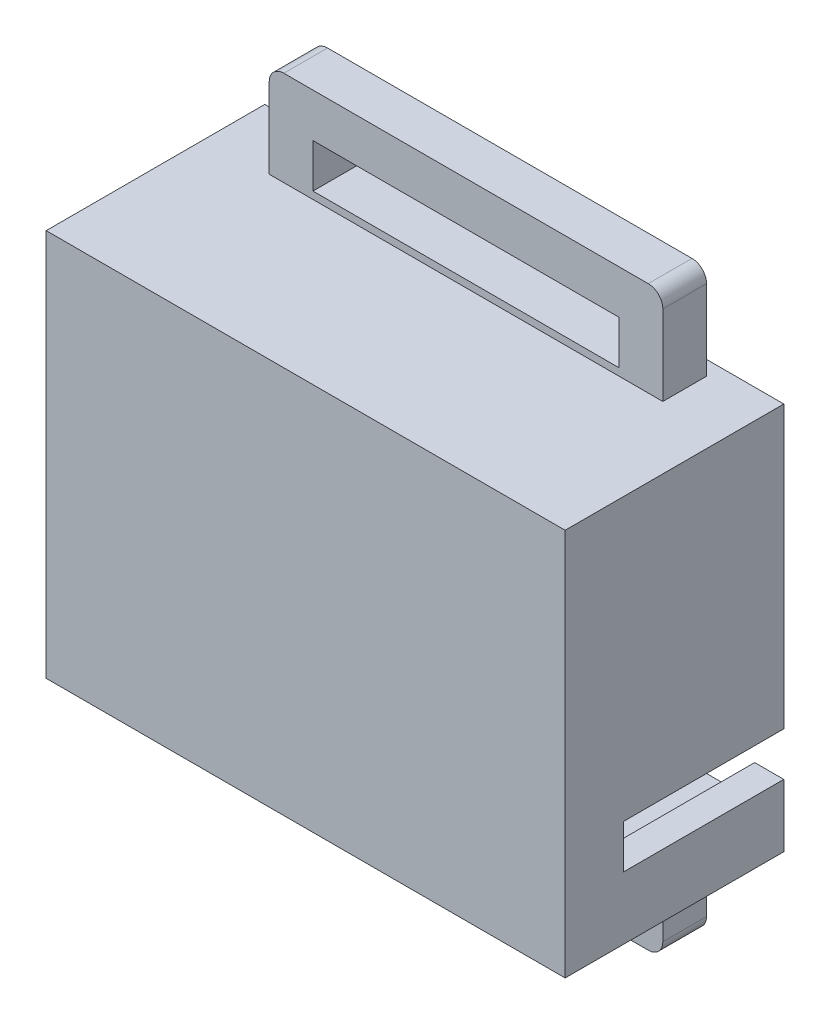
ISO-10303-21;
HEADER;
FILE_DESCRIPTION(('STEP AP214'),'2;1');
FILE_NAME('part.step','',(''),(''),'','','');
FILE_SCHEMA(('AUTOMOTIVE_DESIGN { 1 0 10303 214 1 1 1 1 }'));
ENDSEC;
DATA;
#1=APPLICATION_CONTEXT('core data for automotive mechanical design processes');
#2=APPLICATION_PROTOCOL_DEFINITION('international standard','automotive_design',2000,#1);
#3=PRODUCT_CONTEXT('',#1,'mechanical');
#4=PRODUCT('Part','Part','',(#3));
#5=PRODUCT_RELATED_PRODUCT_CATEGORY('part','',(#4));
#6=PRODUCT_DEFINITION_FORMATION('','',#4);
#7=PRODUCT_DEFINITION_CONTEXT('part definition',#1,'design');
#8=PRODUCT_DEFINITION('design','',#6,#7);
#9=PRODUCT_DEFINITION_SHAPE('','',#8);
#10=(LENGTH_UNIT() NAMED_UNIT(*) SI_UNIT(.MILLI.,.METRE.));
#11=(NAMED_UNIT(*) PLANE_ANGLE_UNIT() SI_UNIT($,.RADIAN.));
#12=(NAMED_UNIT(*) SI_UNIT($,.STERADIAN.) SOLID_ANGLE_UNIT());
#13=UNCERTAINTY_MEASURE_WITH_UNIT(LENGTH_MEASURE(1.E-05),#10,'distance_accuracy_value','');
#14=(GEOMETRIC_REPRESENTATION_CONTEXT(3) GLOBAL_UNCERTAINTY_ASSIGNED_CONTEXT((#13)) GLOBAL_UNIT_ASSIGNED_CONTEXT((#10,
#11,#12)) REPRESENTATION_CONTEXT('',''));
#15=CARTESIAN_POINT('',(0.,0.,0.));
#16=DIRECTION('',(0.,0.,1.));
#17=DIRECTION('',(1.,0.,0.));
#18=AXIS2_PLACEMENT_3D('',#15,#16,#17);
#19=CARTESIAN_POINT('',(-15.8,-11.3,13.));
#20=DIRECTION('',(0.,0.,1.));
#21=DIRECTION('',(1.,0.,0.));
#22=AXIS2_PLACEMENT_3D('',#19,#20,#21);
#23=PLANE('',#22);
#24=DIRECTION('',(1.,0.,0.));
#25=VECTOR('',#24,1.);
#26=CARTESIAN_POINT('',(-15.8,11.3,13.));
#27=LINE('',#26,#25);
#28=CARTESIAN_POINT('',(-15.8,11.3,13.));
#29=VERTEX_POINT('',#28);
#30=CARTESIAN_POINT('',(15.8,11.3,13.));
#31=VERTEX_POINT('',#30);
#32=EDGE_CURVE('E477',#29,#31,#27,.T.);
#33=ORIENTED_EDGE('',*,*,#32,.T.);
#34=DIRECTION('',(0.,1.,0.));
#35=VECTOR('',#34,1.);
#36=CARTESIAN_POINT('',(15.8,-11.3,13.));
#37=LINE('',#36,#35);
#38=CARTESIAN_POINT('',(15.8,-11.3,13.));
#39=VERTEX_POINT('',#38);
#40=EDGE_CURVE('E445',#39,#31,#37,.T.);
#41=ORIENTED_EDGE('',*,*,#40,.F.);
#42=DIRECTION('',(1.,0.,0.));
#43=VECTOR('',#42,1.);
#44=CARTESIAN_POINT('',(-15.8,-11.3,13.));
#45=LINE('',#44,#43);
#46=CARTESIAN_POINT('',(-15.8,-11.3,13.));
#47=VERTEX_POINT('',#46);
#48=EDGE_CURVE('E34',#47,#39,#45,.T.);
#49=ORIENTED_EDGE('',*,*,#48,.F.);
#50=DIRECTION('',(0.,1.,0.));
#51=VECTOR('',#50,1.);
#52=CARTESIAN_POINT('',(-15.8,-11.3,13.));
#53=LINE('',#52,#51);
#54=EDGE_CURVE('E41',#47,#29,#53,.T.);
#55=ORIENTED_EDGE('',*,*,#54,.T.);
#56=EDGE_LOOP('',(#33,#41,#49,#55));
#57=FACE_BOUND('',#56,.T.);
#58=ADVANCED_FACE('F15',(#57),#23,.F.);
#59=CARTESIAN_POINT('',(-10.5,16.8,0.));
#60=DIRECTION('',(0.,1.,0.));
#61=DIRECTION('',(1.,0.,0.));
#62=AXIS2_PLACEMENT_3D('',#59,#60,#61);
#63=PLANE('',#62);
#64=DIRECTION('',(-1.,0.,0.));
#65=VECTOR('',#64,1.);
#66=CARTESIAN_POINT('',(-12.,16.8,4.));
#67=LINE('',#66,#65);
#68=CARTESIAN_POINT('',(10.5,16.8,4.));
#69=VERTEX_POINT('',#68);
#70=CARTESIAN_POINT('',(-10.5,16.8,4.));
#71=VERTEX_POINT('',#70);
#72=EDGE_CURVE('E508',#69,#71,#67,.T.);
#73=ORIENTED_EDGE('',*,*,#72,.T.);
#74=DIRECTION('',(0.,0.,1.));
#75=VECTOR('',#74,1.);
#76=CARTESIAN_POINT('',(-10.5,16.8,0.));
#77=LINE('',#76,#75);
#78=CARTESIAN_POINT('',(-10.5,16.8,1.));
#79=VERTEX_POINT('',#78);
#80=EDGE_CURVE('E9',#79,#71,#77,.T.);
#81=ORIENTED_EDGE('',*,*,#80,.F.);
#82=DIRECTION('',(-1.,0.,0.));
#83=VECTOR('',#82,1.);
#84=CARTESIAN_POINT('',(-12.,16.8,1.));
#85=LINE('',#84,#83);
#86=CARTESIAN_POINT('',(10.5,16.8,1.));
#87=VERTEX_POINT('',#86);
#88=EDGE_CURVE('E474',#87,#79,#85,.T.);
#89=ORIENTED_EDGE('',*,*,#88,.F.);
#90=DIRECTION('',(0.,0.,1.));
#91=VECTOR('',#90,1.);
#92=CARTESIAN_POINT('',(10.5,16.8,0.));
#93=LINE('',#92,#91);
#94=EDGE_CURVE('E23',#87,#69,#93,.T.);
#95=ORIENTED_EDGE('',*,*,#94,.T.);
#96=EDGE_LOOP('',(#73,#81,#89,#95));
#97=FACE_BOUND('',#96,.T.);
#98=ADVANCED_FACE('F675',(#97),#63,.F.);
#99=CARTESIAN_POINT('',(-10.5,13.8,0.));
#100=DIRECTION('',(1.,0.,0.));
#101=DIRECTION('',(0.,1.,0.));
#102=AXIS2_PLACEMENT_3D('',#99,#100,#101);
#103=PLANE('',#102);
#104=DIRECTION('',(0.,0.,1.));
#105=VECTOR('',#104,1.);
#106=CARTESIAN_POINT('',(-10.5,13.8,0.));
#107=LINE('',#106,#105);
#108=CARTESIAN_POINT('',(-10.5,13.8,1.));
#109=VERTEX_POINT('',#108);
#110=CARTESIAN_POINT('',(-10.5,13.8,4.));
#111=VERTEX_POINT('',#110);
#112=EDGE_CURVE('E406',#109,#111,#107,.T.);
#113=ORIENTED_EDGE('',*,*,#112,.F.);
#114=DIRECTION('',(0.,1.,0.));
#115=VECTOR('',#114,1.);
#116=CARTESIAN_POINT('',(-10.5,13.05,1.));
#117=LINE('',#116,#115);
#118=EDGE_CURVE('E473',#109,#79,#117,.T.);
#119=ORIENTED_EDGE('',*,*,#118,.T.);
#120=ORIENTED_EDGE('',*,*,#80,.T.);
#121=DIRECTION('',(0.,1.,0.));
#122=VECTOR('',#121,1.);
#123=CARTESIAN_POINT('',(-10.5,13.05,4.));
#124=LINE('',#123,#122);
#125=EDGE_CURVE('E513',#111,#71,#124,.T.);
#126=ORIENTED_EDGE('',*,*,#125,.F.);
#127=EDGE_LOOP('',(#113,#119,#120,#126));
#128=FACE_BOUND('',#127,.T.);
#129=ADVANCED_FACE('F657',(#128),#103,.T.);
#130=CARTESIAN_POINT('',(10.5,13.8,0.));
#131=DIRECTION('',(1.,0.,0.));
#132=DIRECTION('',(0.,1.,0.));
#133=AXIS2_PLACEMENT_3D('',#130,#131,#132);
#134=PLANE('',#133);
#135=DIRECTION('',(0.,1.,0.));
#136=VECTOR('',#135,1.);
#137=CARTESIAN_POINT('',(10.5,13.05,4.));
#138=LINE('',#137,#136);
#139=CARTESIAN_POINT('',(10.5,13.8,4.));
#140=VERTEX_POINT('',#139);
#141=EDGE_CURVE('E511',#140,#69,#138,.T.);
#142=ORIENTED_EDGE('',*,*,#141,.T.);
#143=ORIENTED_EDGE('',*,*,#94,.F.);
#144=DIRECTION('',(0.,1.,0.));
#145=VECTOR('',#144,1.);
#146=CARTESIAN_POINT('',(10.5,13.05,1.));
#147=LINE('',#146,#145);
#148=CARTESIAN_POINT('',(10.5,13.8,1.));
#149=VERTEX_POINT('',#148);
#150=EDGE_CURVE('E611',#149,#87,#147,.T.);
#151=ORIENTED_EDGE('',*,*,#150,.F.);
#152=DIRECTION('',(0.,0.,1.));
#153=VECTOR('',#152,1.);
#154=CARTESIAN_POINT('',(10.5,13.8,0.));
#155=LINE('',#154,#153);
#156=EDGE_CURVE('E650',#149,#140,#155,.T.);
#157=ORIENTED_EDGE('',*,*,#156,.T.);
#158=EDGE_LOOP('',(#142,#143,#151,#157));
#159=FACE_BOUND('',#158,.T.);
#160=ADVANCED_FACE('F663',(#159),#134,.F.);
#161=CARTESIAN_POINT('',(-10.5,13.8,0.));
#162=DIRECTION('',(0.,1.,0.));
#163=DIRECTION('',(1.,0.,0.));
#164=AXIS2_PLACEMENT_3D('',#161,#162,#163);
#165=PLANE('',#164);
#166=ORIENTED_EDGE('',*,*,#156,.F.);
#167=DIRECTION('',(-1.,0.,0.));
#168=VECTOR('',#167,1.);
#169=CARTESIAN_POINT('',(-12.,13.8,1.));
#170=LINE('',#169,#168);
#171=EDGE_CURVE('E450',#149,#109,#170,.T.);
#172=ORIENTED_EDGE('',*,*,#171,.T.);
#173=ORIENTED_EDGE('',*,*,#112,.T.);
#174=DIRECTION('',(-1.,0.,0.));
#175=VECTOR('',#174,1.);
#176=CARTESIAN_POINT('',(-12.,13.8,4.));
#177=LINE('',#176,#175);
#178=EDGE_CURVE('E432',#140,#111,#177,.T.);
#179=ORIENTED_EDGE('',*,*,#178,.F.);
#180=EDGE_LOOP('',(#166,#172,#173,#179));
#181=FACE_BOUND('',#180,.T.);
#182=ADVANCED_FACE('F652',(#181),#165,.T.);
#183=CARTESIAN_POINT('',(12.5,18.8,1.));
#184=DIRECTION('',(0.,0.,1.));
#185=DIRECTION('',(1.,0.,0.));
#186=AXIS2_PLACEMENT_3D('',#183,#184,#185);
#187=CYLINDRICAL_SURFACE('',#186,1.);
#188=CARTESIAN_POINT('',(12.5,18.8,1.));
#189=DIRECTION('',(0.,0.,1.));
#190=DIRECTION('',(0.,-1.,0.));
#191=AXIS2_PLACEMENT_3D('',#188,#189,#190);
#192=CIRCLE('',#191,1.);
#193=CARTESIAN_POINT('',(13.5,18.8,1.));
#194=VERTEX_POINT('',#193);
#195=CARTESIAN_POINT('',(12.5,19.8,1.));
#196=VERTEX_POINT('',#195);
#197=EDGE_CURVE('E610',#194,#196,#192,.T.);
#198=ORIENTED_EDGE('',*,*,#197,.T.);
#199=DIRECTION('',(0.,0.,1.));
#200=VECTOR('',#199,1.);
#201=CARTESIAN_POINT('',(12.5,19.8,1.));
#202=LINE('',#201,#200);
#203=CARTESIAN_POINT('',(12.5,19.8,4.));
#204=VERTEX_POINT('',#203);
#205=EDGE_CURVE('E583',#196,#204,#202,.T.);
#206=ORIENTED_EDGE('',*,*,#205,.T.);
#207=CARTESIAN_POINT('',(12.5,18.8,4.));
#208=DIRECTION('',(0.,0.,1.));
#209=DIRECTION('',(0.,-1.,0.));
#210=AXIS2_PLACEMENT_3D('',#207,#208,#209);
#211=CIRCLE('',#210,1.);
#212=CARTESIAN_POINT('',(13.5,18.8,4.));
#213=VERTEX_POINT('',#212);
#214=EDGE_CURVE('E580',#213,#204,#211,.T.);
#215=ORIENTED_EDGE('',*,*,#214,.F.);
#216=DIRECTION('',(0.,0.,1.));
#217=VECTOR('',#216,1.);
#218=CARTESIAN_POINT('',(13.5,18.8,1.));
#219=LINE('',#218,#217);
#220=EDGE_CURVE('E362',#194,#213,#219,.T.);
#221=ORIENTED_EDGE('',*,*,#220,.F.);
#222=EDGE_LOOP('',(#198,#206,#215,#221));
#223=FACE_BOUND('',#222,.T.);
#224=ADVANCED_FACE('F784',(#223),#187,.T.);
#225=CARTESIAN_POINT('',(-13.5,19.8,1.));
#226=DIRECTION('',(0.,1.,0.));
#227=DIRECTION('',(1.,0.,0.));
#228=AXIS2_PLACEMENT_3D('',#225,#226,#227);
#229=PLANE('',#228);
#230=DIRECTION('',(1.,0.,0.));
#231=VECTOR('',#230,1.);
#232=CARTESIAN_POINT('',(-13.5,19.8,1.));
#233=LINE('',#232,#231);
#234=CARTESIAN_POINT('',(-12.5,19.8,1.));
#235=VERTEX_POINT('',#234);
#236=EDGE_CURVE('E546',#235,#196,#233,.T.);
#237=ORIENTED_EDGE('',*,*,#236,.F.);
#238=DIRECTION('',(0.,0.,1.));
#239=VECTOR('',#238,1.);
#240=CARTESIAN_POINT('',(-12.5,19.8,1.));
#241=LINE('',#240,#239);
#242=CARTESIAN_POINT('',(-12.5,19.8,4.));
#243=VERTEX_POINT('',#242);
#244=EDGE_CURVE('E578',#235,#243,#241,.T.);
#245=ORIENTED_EDGE('',*,*,#244,.T.);
#246=DIRECTION('',(1.,0.,0.));
#247=VECTOR('',#246,1.);
#248=CARTESIAN_POINT('',(-13.5,19.8,4.));
#249=LINE('',#248,#247);
#250=EDGE_CURVE('E434',#243,#204,#249,.T.);
#251=ORIENTED_EDGE('',*,*,#250,.T.);
#252=ORIENTED_EDGE('',*,*,#205,.F.);
#253=EDGE_LOOP('',(#237,#245,#251,#252));
#254=FACE_BOUND('',#253,.T.);
#255=ADVANCED_FACE('F725',(#254),#229,.T.);
#256=CARTESIAN_POINT('',(-12.5,18.8,1.));
#257=DIRECTION('',(0.,0.,1.));
#258=DIRECTION('',(-1.,0.,0.));
#259=AXIS2_PLACEMENT_3D('',#256,#257,#258);
#260=CYLINDRICAL_SURFACE('',#259,1.);
#261=DIRECTION('',(0.,0.,1.));
#262=VECTOR('',#261,1.);
#263=CARTESIAN_POINT('',(-13.5,18.8,1.));
#264=LINE('',#263,#262);
#265=CARTESIAN_POINT('',(-13.5,18.8,1.));
#266=VERTEX_POINT('',#265);
#267=CARTESIAN_POINT('',(-13.5,18.8,4.));
#268=VERTEX_POINT('',#267);
#269=EDGE_CURVE('E528',#266,#268,#264,.T.);
#270=ORIENTED_EDGE('',*,*,#269,.T.);
#271=CARTESIAN_POINT('',(-12.5,18.8,4.));
#272=DIRECTION('',(0.,0.,-1.));
#273=DIRECTION('',(0.,-1.,0.));
#274=AXIS2_PLACEMENT_3D('',#271,#272,#273);
#275=CIRCLE('',#274,1.);
#276=EDGE_CURVE('E429',#268,#243,#275,.T.);
#277=ORIENTED_EDGE('',*,*,#276,.T.);
#278=ORIENTED_EDGE('',*,*,#244,.F.);
#279=CARTESIAN_POINT('',(-12.5,18.8,1.));
#280=DIRECTION('',(0.,0.,-1.));
#281=DIRECTION('',(0.,-1.,0.));
#282=AXIS2_PLACEMENT_3D('',#279,#280,#281);
#283=CIRCLE('',#282,1.);
#284=EDGE_CURVE('E364',#266,#235,#283,.T.);
#285=ORIENTED_EDGE('',*,*,#284,.F.);
#286=EDGE_LOOP('',(#270,#277,#278,#285));
#287=FACE_BOUND('',#286,.T.);
#288=ADVANCED_FACE('F721',(#287),#260,.T.);
#289=CARTESIAN_POINT('',(-10.5,-13.8,0.));
#290=DIRECTION('',(0.,1.,0.));
#291=DIRECTION('',(1.,0.,0.));
#292=AXIS2_PLACEMENT_3D('',#289,#290,#291);
#293=PLANE('',#292);
#294=DIRECTION('',(-1.,0.,0.));
#295=VECTOR('',#294,1.);
#296=CARTESIAN_POINT('',(-12.,-13.8,4.));
#297=LINE('',#296,#295);
#298=CARTESIAN_POINT('',(10.5,-13.8,4.));
#299=VERTEX_POINT('',#298);
#300=CARTESIAN_POINT('',(-10.5,-13.8,4.));
#301=VERTEX_POINT('',#300);
#302=EDGE_CURVE('E334',#299,#301,#297,.T.);
#303=ORIENTED_EDGE('',*,*,#302,.T.);
#304=DIRECTION('',(0.,0.,1.));
#305=VECTOR('',#304,1.);
#306=CARTESIAN_POINT('',(-10.5,-13.8,0.));
#307=LINE('',#306,#305);
#308=CARTESIAN_POINT('',(-10.5,-13.8,1.));
#309=VERTEX_POINT('',#308);
#310=EDGE_CURVE('E582',#309,#301,#307,.T.);
#311=ORIENTED_EDGE('',*,*,#310,.F.);
#312=DIRECTION('',(-1.,0.,0.));
#313=VECTOR('',#312,1.);
#314=CARTESIAN_POINT('',(-12.,-13.8,1.));
#315=LINE('',#314,#313);
#316=CARTESIAN_POINT('',(10.5,-13.8,1.));
#317=VERTEX_POINT('',#316);
#318=EDGE_CURVE('E382',#317,#309,#315,.T.);
#319=ORIENTED_EDGE('',*,*,#318,.F.);
#320=DIRECTION('',(0.,0.,1.));
#321=VECTOR('',#320,1.);
#322=CARTESIAN_POINT('',(10.5,-13.8,0.));
#323=LINE('',#322,#321);
#324=EDGE_CURVE('E639',#317,#299,#323,.T.);
#325=ORIENTED_EDGE('',*,*,#324,.T.);
#326=EDGE_LOOP('',(#303,#311,#319,#325));
#327=FACE_BOUND('',#326,.T.);
#328=ADVANCED_FACE('F723',(#327),#293,.F.);
#329=CARTESIAN_POINT('',(-10.5,-16.8,0.));
#330=DIRECTION('',(1.,0.,0.));
#331=DIRECTION('',(0.,1.,0.));
#332=AXIS2_PLACEMENT_3D('',#329,#330,#331);
#333=PLANE('',#332);
#334=DIRECTION('',(0.,0.,1.));
#335=VECTOR('',#334,1.);
#336=CARTESIAN_POINT('',(-10.5,-16.8,0.));
#337=LINE('',#336,#335);
#338=CARTESIAN_POINT('',(-10.5,-16.8,1.));
#339=VERTEX_POINT('',#338);
#340=CARTESIAN_POINT('',(-10.5,-16.8,4.));
#341=VERTEX_POINT('',#340);
#342=EDGE_CURVE('E345',#339,#341,#337,.T.);
#343=ORIENTED_EDGE('',*,*,#342,.F.);
#344=DIRECTION('',(0.,1.,0.));
#345=VECTOR('',#344,1.);
#346=CARTESIAN_POINT('',(-10.5,-18.3,1.));
#347=LINE('',#346,#345);
#348=EDGE_CURVE('E527',#339,#309,#347,.T.);
#349=ORIENTED_EDGE('',*,*,#348,.T.);
#350=ORIENTED_EDGE('',*,*,#310,.T.);
#351=DIRECTION('',(0.,1.,0.));
#352=VECTOR('',#351,1.);
#353=CARTESIAN_POINT('',(-10.5,-18.3,4.));
#354=LINE('',#353,#352);
#355=EDGE_CURVE('E337',#341,#301,#354,.T.);
#356=ORIENTED_EDGE('',*,*,#355,.F.);
#357=EDGE_LOOP('',(#343,#349,#350,#356));
#358=FACE_BOUND('',#357,.T.);
#359=ADVANCED_FACE('F773',(#358),#333,.T.);
#360=CARTESIAN_POINT('',(10.5,-16.8,0.));
#361=DIRECTION('',(1.,0.,0.));
#362=DIRECTION('',(0.,1.,0.));
#363=AXIS2_PLACEMENT_3D('',#360,#361,#362);
#364=PLANE('',#363);
#365=DIRECTION('',(0.,1.,0.));
#366=VECTOR('',#365,1.);
#367=CARTESIAN_POINT('',(10.5,-18.3,4.));
#368=LINE('',#367,#366);
#369=CARTESIAN_POINT('',(10.5,-16.8,4.));
#370=VERTEX_POINT('',#369);
#371=EDGE_CURVE('E336',#370,#299,#368,.T.);
#372=ORIENTED_EDGE('',*,*,#371,.T.);
#373=ORIENTED_EDGE('',*,*,#324,.F.);
#374=DIRECTION('',(0.,1.,0.));
#375=VECTOR('',#374,1.);
#376=CARTESIAN_POINT('',(10.5,-18.3,1.));
#377=LINE('',#376,#375);
#378=CARTESIAN_POINT('',(10.5,-16.8,1.));
#379=VERTEX_POINT('',#378);
#380=EDGE_CURVE('E377',#379,#317,#377,.T.);
#381=ORIENTED_EDGE('',*,*,#380,.F.);
#382=DIRECTION('',(0.,0.,1.));
#383=VECTOR('',#382,1.);
#384=CARTESIAN_POINT('',(10.5,-16.8,0.));
#385=LINE('',#384,#383);
#386=EDGE_CURVE('E338',#379,#370,#385,.T.);
#387=ORIENTED_EDGE('',*,*,#386,.T.);
#388=EDGE_LOOP('',(#372,#373,#381,#387));
#389=FACE_BOUND('',#388,.T.);
#390=ADVANCED_FACE('F772',(#389),#364,.F.);
#391=CARTESIAN_POINT('',(-10.5,-16.8,0.));
#392=DIRECTION('',(0.,1.,0.));
#393=DIRECTION('',(1.,0.,0.));
#394=AXIS2_PLACEMENT_3D('',#391,#392,#393);
#395=PLANE('',#394);
#396=ORIENTED_EDGE('',*,*,#386,.F.);
#397=DIRECTION('',(-1.,0.,0.));
#398=VECTOR('',#397,1.);
#399=CARTESIAN_POINT('',(-12.,-16.8,1.));
#400=LINE('',#399,#398);
#401=EDGE_CURVE('E525',#379,#339,#400,.T.);
#402=ORIENTED_EDGE('',*,*,#401,.T.);
#403=ORIENTED_EDGE('',*,*,#342,.T.);
#404=DIRECTION('',(-1.,0.,0.));
#405=VECTOR('',#404,1.);
#406=CARTESIAN_POINT('',(-12.,-16.8,4.));
#407=LINE('',#406,#405);
#408=EDGE_CURVE('E534',#370,#341,#407,.T.);
#409=ORIENTED_EDGE('',*,*,#408,.F.);
#410=EDGE_LOOP('',(#396,#402,#403,#409));
#411=FACE_BOUND('',#410,.T.);
#412=ADVANCED_FACE('F770',(#411),#395,.T.);
#413=CARTESIAN_POINT('',(-13.5,-19.8,1.));
#414=DIRECTION('',(0.,1.,0.));
#415=DIRECTION('',(1.,0.,0.));
#416=AXIS2_PLACEMENT_3D('',#413,#414,#415);
#417=PLANE('',#416);
#418=DIRECTION('',(0.,0.,1.));
#419=VECTOR('',#418,1.);
#420=CARTESIAN_POINT('',(12.5,-19.8,1.));
#421=LINE('',#420,#419);
#422=CARTESIAN_POINT('',(12.5,-19.8,1.));
#423=VERTEX_POINT('',#422);
#424=CARTESIAN_POINT('',(12.5,-19.8,4.));
#425=VERTEX_POINT('',#424);
#426=EDGE_CURVE('E343',#423,#425,#421,.T.);
#427=ORIENTED_EDGE('',*,*,#426,.T.);
#428=DIRECTION('',(1.,0.,0.));
#429=VECTOR('',#428,1.);
#430=CARTESIAN_POINT('',(-13.5,-19.8,4.));
#431=LINE('',#430,#429);
#432=CARTESIAN_POINT('',(-12.5,-19.8,4.));
#433=VERTEX_POINT('',#432);
#434=EDGE_CURVE('E520',#433,#425,#431,.T.);
#435=ORIENTED_EDGE('',*,*,#434,.F.);
#436=DIRECTION('',(0.,0.,1.));
#437=VECTOR('',#436,1.);
#438=CARTESIAN_POINT('',(-12.5,-19.8,1.));
#439=LINE('',#438,#437);
#440=CARTESIAN_POINT('',(-12.5,-19.8,1.));
#441=VERTEX_POINT('',#440);
#442=EDGE_CURVE('E335',#441,#433,#439,.T.);
#443=ORIENTED_EDGE('',*,*,#442,.F.);
#444=DIRECTION('',(1.,0.,0.));
#445=VECTOR('',#444,1.);
#446=CARTESIAN_POINT('',(-13.5,-19.8,1.));
#447=LINE('',#446,#445);
#448=EDGE_CURVE('E423',#441,#423,#447,.T.);
#449=ORIENTED_EDGE('',*,*,#448,.T.);
#450=EDGE_LOOP('',(#427,#435,#443,#449));
#451=FACE_BOUND('',#450,.T.);
#452=ADVANCED_FACE('F763',(#451),#417,.F.);
#453=CARTESIAN_POINT('',(12.5,-18.8,1.));
#454=DIRECTION('',(0.,0.,1.));
#455=DIRECTION('',(1.,0.,0.));
#456=AXIS2_PLACEMENT_3D('',#453,#454,#455);
#457=CYLINDRICAL_SURFACE('',#456,1.);
#458=DIRECTION('',(0.,0.,1.));
#459=VECTOR('',#458,1.);
#460=CARTESIAN_POINT('',(13.5,-18.8,1.));
#461=LINE('',#460,#459);
#462=CARTESIAN_POINT('',(13.5,-18.8,1.));
#463=VERTEX_POINT('',#462);
#464=CARTESIAN_POINT('',(13.5,-18.8,4.));
#465=VERTEX_POINT('',#464);
#466=EDGE_CURVE('E392',#463,#465,#461,.T.);
#467=ORIENTED_EDGE('',*,*,#466,.T.);
#468=CARTESIAN_POINT('',(12.5,-18.8,4.));
#469=DIRECTION('',(0.,0.,-1.));
#470=DIRECTION('',(0.,-1.,0.));
#471=AXIS2_PLACEMENT_3D('',#468,#469,#470);
#472=CIRCLE('',#471,1.);
#473=EDGE_CURVE('E521',#465,#425,#472,.T.);
#474=ORIENTED_EDGE('',*,*,#473,.T.);
#475=ORIENTED_EDGE('',*,*,#426,.F.);
#476=CARTESIAN_POINT('',(12.5,-18.8,1.));
#477=DIRECTION('',(0.,0.,-1.));
#478=DIRECTION('',(0.,-1.,0.));
#479=AXIS2_PLACEMENT_3D('',#476,#477,#478);
#480=CIRCLE('',#479,1.);
#481=EDGE_CURVE('E391',#463,#423,#480,.T.);
#482=ORIENTED_EDGE('',*,*,#481,.F.);
#483=EDGE_LOOP('',(#467,#474,#475,#482));
#484=FACE_BOUND('',#483,.T.);
#485=ADVANCED_FACE('F757',(#484),#457,.T.);
#486=CARTESIAN_POINT('',(-12.5,-18.8,1.));
#487=DIRECTION('',(0.,0.,1.));
#488=DIRECTION('',(-1.,0.,0.));
#489=AXIS2_PLACEMENT_3D('',#486,#487,#488);
#490=CYLINDRICAL_SURFACE('',#489,1.);
#491=CARTESIAN_POINT('',(-12.5,-18.8,1.));
#492=DIRECTION('',(0.,0.,1.));
#493=DIRECTION('',(0.,-1.,0.));
#494=AXIS2_PLACEMENT_3D('',#491,#492,#493);
#495=CIRCLE('',#494,1.);
#496=CARTESIAN_POINT('',(-13.5,-18.8,1.));
#497=VERTEX_POINT('',#496);
#498=EDGE_CURVE('E383',#497,#441,#495,.T.);
#499=ORIENTED_EDGE('',*,*,#498,.T.);
#500=ORIENTED_EDGE('',*,*,#442,.T.);
#501=CARTESIAN_POINT('',(-12.5,-18.8,4.));
#502=DIRECTION('',(0.,0.,1.));
#503=DIRECTION('',(0.,-1.,0.));
#504=AXIS2_PLACEMENT_3D('',#501,#502,#503);
#505=CIRCLE('',#504,1.);
#506=CARTESIAN_POINT('',(-13.5,-18.8,4.));
#507=VERTEX_POINT('',#506);
#508=EDGE_CURVE('E510',#507,#433,#505,.T.);
#509=ORIENTED_EDGE('',*,*,#508,.F.);
#510=DIRECTION('',(0.,0.,1.));
#511=VECTOR('',#510,1.);
#512=CARTESIAN_POINT('',(-13.5,-18.8,1.));
#513=LINE('',#512,#511);
#514=EDGE_CURVE('E367',#497,#507,#513,.T.);
#515=ORIENTED_EDGE('',*,*,#514,.F.);
#516=EDGE_LOOP('',(#499,#500,#509,#515));
#517=FACE_BOUND('',#516,.T.);
#518=ADVANCED_FACE('F752',(#517),#490,.T.);
#519=CARTESIAN_POINT('',(14.8,-9.,11.));
#520=DIRECTION('',(0.,0.,1.));
#521=DIRECTION('',(1.,0.,0.));
#522=AXIS2_PLACEMENT_3D('',#519,#520,#521);
#523=PLANE('',#522);
#524=DIRECTION('',(0.,-1.,0.));
#525=VECTOR('',#524,1.);
#526=CARTESIAN_POINT('',(17.8,-11.15,11.));
#527=LINE('',#526,#525);
#528=CARTESIAN_POINT('',(17.8,-6.,11.));
#529=VERTEX_POINT('',#528);
#530=CARTESIAN_POINT('',(17.8,-9.,11.));
#531=VERTEX_POINT('',#530);
#532=EDGE_CURVE('E355',#529,#531,#527,.T.);
#533=ORIENTED_EDGE('',*,*,#532,.T.);
#534=DIRECTION('',(1.,0.,0.));
#535=VECTOR('',#534,1.);
#536=CARTESIAN_POINT('',(14.8,-9.,11.));
#537=LINE('',#536,#535);
#538=CARTESIAN_POINT('',(15.8,-9.,11.));
#539=VERTEX_POINT('',#538);
#540=EDGE_CURVE('E329',#539,#531,#537,.T.);
#541=ORIENTED_EDGE('',*,*,#540,.F.);
#542=DIRECTION('',(0.,-1.,0.));
#543=VECTOR('',#542,1.);
#544=CARTESIAN_POINT('',(15.8,-10.15,11.));
#545=LINE('',#544,#543);
#546=CARTESIAN_POINT('',(15.8,-6.,11.));
#547=VERTEX_POINT('',#546);
#548=EDGE_CURVE('E350',#547,#539,#545,.T.);
#549=ORIENTED_EDGE('',*,*,#548,.F.);
#550=DIRECTION('',(1.,0.,0.));
#551=VECTOR('',#550,1.);
#552=CARTESIAN_POINT('',(14.8,-6.,11.));
#553=LINE('',#552,#551);
#554=EDGE_CURVE('E438',#547,#529,#553,.T.);
#555=ORIENTED_EDGE('',*,*,#554,.T.);
#556=EDGE_LOOP('',(#533,#541,#549,#555));
#557=FACE_BOUND('',#556,.T.);
#558=ADVANCED_FACE('F753',(#557),#523,.F.);
#559=CARTESIAN_POINT('',(14.8,-9.,-1.));
#560=DIRECTION('',(0.,1.,0.));
#561=DIRECTION('',(1.,0.,0.));
#562=AXIS2_PLACEMENT_3D('',#559,#560,#561);
#563=PLANE('',#562);
#564=ORIENTED_EDGE('',*,*,#540,.T.);
#565=DIRECTION('',(0.,0.,1.));
#566=VECTOR('',#565,1.);
#567=CARTESIAN_POINT('',(17.8,-9.,-0.5));
#568=LINE('',#567,#566);
#569=CARTESIAN_POINT('',(17.8,-9.,0.));
#570=VERTEX_POINT('',#569);
#571=EDGE_CURVE('E360',#570,#531,#568,.T.);
#572=ORIENTED_EDGE('',*,*,#571,.F.);
#573=DIRECTION('',(-1.,0.,0.));
#574=VECTOR('',#573,1.);
#575=CARTESIAN_POINT('',(-1.5,-9.,0.));
#576=LINE('',#575,#574);
#577=CARTESIAN_POINT('',(15.8,-9.,0.));
#578=VERTEX_POINT('',#577);
#579=EDGE_CURVE('E479',#570,#578,#576,.T.);
#580=ORIENTED_EDGE('',*,*,#579,.T.);
#581=DIRECTION('',(0.,0.,1.));
#582=VECTOR('',#581,1.);
#583=CARTESIAN_POINT('',(15.8,-9.,-1.));
#584=LINE('',#583,#582);
#585=EDGE_CURVE('E349',#578,#539,#584,.T.);
#586=ORIENTED_EDGE('',*,*,#585,.T.);
#587=EDGE_LOOP('',(#564,#572,#580,#586));
#588=FACE_BOUND('',#587,.T.);
#589=ADVANCED_FACE('F744',(#588),#563,.T.);
#590=CARTESIAN_POINT('',(-15.8,-11.3,-1.));
#591=DIRECTION('',(0.,1.,0.));
#592=DIRECTION('',(1.,0.,0.));
#593=AXIS2_PLACEMENT_3D('',#590,#591,#592);
#594=PLANE('',#593);
#595=DIRECTION('',(0.,0.,1.));
#596=VECTOR('',#595,1.);
#597=CARTESIAN_POINT('',(15.8,-11.3,-1.));
#598=LINE('',#597,#596);
#599=CARTESIAN_POINT('',(15.8,-11.3,0.));
#600=VERTEX_POINT('',#599);
#601=EDGE_CURVE('E482',#600,#39,#598,.T.);
#602=ORIENTED_EDGE('',*,*,#601,.F.);
#603=DIRECTION('',(-1.,0.,0.));
#604=VECTOR('',#603,1.);
#605=CARTESIAN_POINT('',(-16.8,-11.3,0.));
#606=LINE('',#605,#604);
#607=CARTESIAN_POINT('',(-15.8,-11.3,0.));
#608=VERTEX_POINT('',#607);
#609=EDGE_CURVE('E466',#600,#608,#606,.T.);
#610=ORIENTED_EDGE('',*,*,#609,.T.);
#611=DIRECTION('',(0.,0.,1.));
#612=VECTOR('',#611,1.);
#613=CARTESIAN_POINT('',(-15.8,-11.3,-1.));
#614=LINE('',#613,#612);
#615=EDGE_CURVE('E626',#608,#47,#614,.T.);
#616=ORIENTED_EDGE('',*,*,#615,.T.);
#617=ORIENTED_EDGE('',*,*,#48,.T.);
#618=EDGE_LOOP('',(#602,#610,#616,#617));
#619=FACE_BOUND('',#618,.T.);
#620=ADVANCED_FACE('F741',(#619),#594,.T.);
#621=CARTESIAN_POINT('',(-15.8,-11.3,-1.));
#622=DIRECTION('',(1.,0.,0.));
#623=DIRECTION('',(0.,1.,0.));
#624=AXIS2_PLACEMENT_3D('',#621,#622,#623);
#625=PLANE('',#624);
#626=ORIENTED_EDGE('',*,*,#615,.F.);
#627=DIRECTION('',(0.,1.,0.));
#628=VECTOR('',#627,1.);
#629=CARTESIAN_POINT('',(-15.8,-12.3,0.));
#630=LINE('',#629,#628);
#631=CARTESIAN_POINT('',(-15.8,11.3,0.));
#632=VERTEX_POINT('',#631);
#633=EDGE_CURVE('E465',#608,#632,#630,.T.);
#634=ORIENTED_EDGE('',*,*,#633,.T.);
#635=DIRECTION('',(0.,0.,1.));
#636=VECTOR('',#635,1.);
#637=CARTESIAN_POINT('',(-15.8,11.3,-1.));
#638=LINE('',#637,#636);
#639=EDGE_CURVE('E483',#632,#29,#638,.T.);
#640=ORIENTED_EDGE('',*,*,#639,.T.);
#641=ORIENTED_EDGE('',*,*,#54,.F.);
#642=EDGE_LOOP('',(#626,#634,#640,#641));
#643=FACE_BOUND('',#642,.T.);
#644=ADVANCED_FACE('F740',(#643),#625,.T.);
#645=CARTESIAN_POINT('',(-15.8,11.3,-1.));
#646=DIRECTION('',(0.,1.,0.));
#647=DIRECTION('',(1.,0.,0.));
#648=AXIS2_PLACEMENT_3D('',#645,#646,#647);
#649=PLANE('',#648);
#650=ORIENTED_EDGE('',*,*,#32,.F.);
#651=ORIENTED_EDGE('',*,*,#639,.F.);
#652=DIRECTION('',(-1.,0.,0.));
#653=VECTOR('',#652,1.);
#654=CARTESIAN_POINT('',(-16.8,11.3,0.));
#655=LINE('',#654,#653);
#656=CARTESIAN_POINT('',(15.8,11.3,0.));
#657=VERTEX_POINT('',#656);
#658=EDGE_CURVE('E458',#657,#632,#655,.T.);
#659=ORIENTED_EDGE('',*,*,#658,.F.);
#660=DIRECTION('',(0.,0.,1.));
#661=VECTOR('',#660,1.);
#662=CARTESIAN_POINT('',(15.8,11.3,-1.));
#663=LINE('',#662,#661);
#664=EDGE_CURVE('E351',#657,#31,#663,.T.);
#665=ORIENTED_EDGE('',*,*,#664,.T.);
#666=EDGE_LOOP('',(#650,#651,#659,#665));
#667=FACE_BOUND('',#666,.T.);
#668=ADVANCED_FACE('F733',(#667),#649,.F.);
#669=CARTESIAN_POINT('',(15.8,-11.3,-1.));
#670=DIRECTION('',(1.,0.,0.));
#671=DIRECTION('',(0.,1.,0.));
#672=AXIS2_PLACEMENT_3D('',#669,#670,#671);
#673=PLANE('',#672);
#674=ORIENTED_EDGE('',*,*,#40,.T.);
#675=ORIENTED_EDGE('',*,*,#664,.F.);
#676=DIRECTION('',(0.,1.,0.));
#677=VECTOR('',#676,1.);
#678=CARTESIAN_POINT('',(15.8,-12.3,0.));
#679=LINE('',#678,#677);
#680=CARTESIAN_POINT('',(15.8,-6.,0.));
#681=VERTEX_POINT('',#680);
#682=EDGE_CURVE('E452',#681,#657,#679,.T.);
#683=ORIENTED_EDGE('',*,*,#682,.F.);
#684=DIRECTION('',(0.,0.,1.));
#685=VECTOR('',#684,1.);
#686=CARTESIAN_POINT('',(15.8,-6.,-1.));
#687=LINE('',#686,#685);
#688=EDGE_CURVE('E444',#681,#547,#687,.T.);
#689=ORIENTED_EDGE('',*,*,#688,.T.);
#690=ORIENTED_EDGE('',*,*,#548,.T.);
#691=ORIENTED_EDGE('',*,*,#585,.F.);
#692=DIRECTION('',(0.,1.,0.));
#693=VECTOR('',#692,1.);
#694=CARTESIAN_POINT('',(15.8,-12.3,0.));
#695=LINE('',#694,#693);
#696=EDGE_CURVE('E469',#600,#578,#695,.T.);
#697=ORIENTED_EDGE('',*,*,#696,.F.);
#698=ORIENTED_EDGE('',*,*,#601,.T.);
#699=EDGE_LOOP('',(#674,#675,#683,#689,#690,#691,#697,#698));
#700=FACE_BOUND('',#699,.T.);
#701=ADVANCED_FACE('F729',(#700),#673,.F.);
#702=CARTESIAN_POINT('',(14.8,-6.,-1.));
#703=DIRECTION('',(0.,1.,0.));
#704=DIRECTION('',(1.,0.,0.));
#705=AXIS2_PLACEMENT_3D('',#702,#703,#704);
#706=PLANE('',#705);
#707=ORIENTED_EDGE('',*,*,#688,.F.);
#708=DIRECTION('',(-1.,0.,0.));
#709=VECTOR('',#708,1.);
#710=CARTESIAN_POINT('',(-1.5,-6.,0.));
#711=LINE('',#710,#709);
#712=CARTESIAN_POINT('',(17.8,-6.,0.));
#713=VERTEX_POINT('',#712);
#714=EDGE_CURVE('E397',#713,#681,#711,.T.);
#715=ORIENTED_EDGE('',*,*,#714,.F.);
#716=DIRECTION('',(0.,0.,1.));
#717=VECTOR('',#716,1.);
#718=CARTESIAN_POINT('',(17.8,-6.,-0.5));
#719=LINE('',#718,#717);
#720=EDGE_CURVE('E356',#713,#529,#719,.T.);
#721=ORIENTED_EDGE('',*,*,#720,.T.);
#722=ORIENTED_EDGE('',*,*,#554,.F.);
#723=EDGE_LOOP('',(#707,#715,#721,#722));
#724=FACE_BOUND('',#723,.T.);
#725=ADVANCED_FACE('F685',(#724),#706,.F.);
#726=CARTESIAN_POINT('',(-13.5,12.3,1.));
#727=DIRECTION('',(0.,0.,1.));
#728=DIRECTION('',(1.,0.,0.));
#729=AXIS2_PLACEMENT_3D('',#726,#727,#728);
#730=PLANE('',#729);
#731=ORIENTED_EDGE('',*,*,#150,.T.);
#732=ORIENTED_EDGE('',*,*,#88,.T.);
#733=ORIENTED_EDGE('',*,*,#118,.F.);
#734=ORIENTED_EDGE('',*,*,#171,.F.);
#735=EDGE_LOOP('',(#731,#732,#733,#734));
#736=FACE_BOUND('',#735,.T.);
#737=ORIENTED_EDGE('',*,*,#284,.T.);
#738=ORIENTED_EDGE('',*,*,#236,.T.);
#739=ORIENTED_EDGE('',*,*,#197,.F.);
#740=DIRECTION('',(0.,1.,0.));
#741=VECTOR('',#740,1.);
#742=CARTESIAN_POINT('',(13.5,12.3,1.));
#743=LINE('',#742,#741);
#744=CARTESIAN_POINT('',(13.5,13.3,1.));
#745=VERTEX_POINT('',#744);
#746=EDGE_CURVE('E368',#745,#194,#743,.T.);
#747=ORIENTED_EDGE('',*,*,#746,.F.);
#748=DIRECTION('',(1.,0.,0.));
#749=VECTOR('',#748,1.);
#750=CARTESIAN_POINT('',(-15.65,13.3,1.));
#751=LINE('',#750,#749);
#752=CARTESIAN_POINT('',(-13.5,13.3,1.));
#753=VERTEX_POINT('',#752);
#754=EDGE_CURVE('E380',#753,#745,#751,.T.);
#755=ORIENTED_EDGE('',*,*,#754,.F.);
#756=DIRECTION('',(0.,1.,0.));
#757=VECTOR('',#756,1.);
#758=CARTESIAN_POINT('',(-13.5,12.3,1.));
#759=LINE('',#758,#757);
#760=EDGE_CURVE('E564',#753,#266,#759,.T.);
#761=ORIENTED_EDGE('',*,*,#760,.T.);
#762=EDGE_LOOP('',(#737,#738,#739,#747,#755,#761));
#763=FACE_BOUND('',#762,.T.);
#764=ADVANCED_FACE('F668',(#736,#763),#730,.F.);
#765=CARTESIAN_POINT('',(13.5,12.3,1.));
#766=DIRECTION('',(1.,0.,0.));
#767=DIRECTION('',(0.,1.,0.));
#768=AXIS2_PLACEMENT_3D('',#765,#766,#767);
#769=PLANE('',#768);
#770=DIRECTION('',(0.,1.,0.));
#771=VECTOR('',#770,1.);
#772=CARTESIAN_POINT('',(13.5,12.3,4.));
#773=LINE('',#772,#771);
#774=CARTESIAN_POINT('',(13.5,13.3,4.));
#775=VERTEX_POINT('',#774);
#776=EDGE_CURVE('E572',#775,#213,#773,.T.);
#777=ORIENTED_EDGE('',*,*,#776,.F.);
#778=DIRECTION('',(0.,0.,1.));
#779=VECTOR('',#778,1.);
#780=CARTESIAN_POINT('',(13.5,13.3,1.));
#781=LINE('',#780,#779);
#782=EDGE_CURVE('E427',#745,#775,#781,.T.);
#783=ORIENTED_EDGE('',*,*,#782,.F.);
#784=ORIENTED_EDGE('',*,*,#746,.T.);
#785=ORIENTED_EDGE('',*,*,#220,.T.);
#786=EDGE_LOOP('',(#777,#783,#784,#785));
#787=FACE_BOUND('',#786,.T.);
#788=ADVANCED_FACE('F688',(#787),#769,.T.);
#789=CARTESIAN_POINT('',(-13.5,12.3,4.));
#790=DIRECTION('',(0.,0.,1.));
#791=DIRECTION('',(1.,0.,0.));
#792=AXIS2_PLACEMENT_3D('',#789,#790,#791);
#793=PLANE('',#792);
#794=ORIENTED_EDGE('',*,*,#178,.T.);
#795=ORIENTED_EDGE('',*,*,#125,.T.);
#796=ORIENTED_EDGE('',*,*,#72,.F.);
#797=ORIENTED_EDGE('',*,*,#141,.F.);
#798=EDGE_LOOP('',(#794,#795,#796,#797));
#799=FACE_BOUND('',#798,.T.);
#800=DIRECTION('',(0.,1.,0.));
#801=VECTOR('',#800,1.);
#802=CARTESIAN_POINT('',(-13.5,12.3,4.));
#803=LINE('',#802,#801);
#804=CARTESIAN_POINT('',(-13.5,13.3,4.));
#805=VERTEX_POINT('',#804);
#806=EDGE_CURVE('E567',#805,#268,#803,.T.);
#807=ORIENTED_EDGE('',*,*,#806,.F.);
#808=DIRECTION('',(1.,0.,0.));
#809=VECTOR('',#808,1.);
#810=CARTESIAN_POINT('',(-15.65,13.3,4.));
#811=LINE('',#810,#809);
#812=EDGE_CURVE('E399',#805,#775,#811,.T.);
#813=ORIENTED_EDGE('',*,*,#812,.T.);
#814=ORIENTED_EDGE('',*,*,#776,.T.);
#815=ORIENTED_EDGE('',*,*,#214,.T.);
#816=ORIENTED_EDGE('',*,*,#250,.F.);
#817=ORIENTED_EDGE('',*,*,#276,.F.);
#818=EDGE_LOOP('',(#807,#813,#814,#815,#816,#817));
#819=FACE_BOUND('',#818,.T.);
#820=ADVANCED_FACE('F665',(#799,#819),#793,.T.);
#821=CARTESIAN_POINT('',(-13.5,12.3,1.));
#822=DIRECTION('',(1.,0.,0.));
#823=DIRECTION('',(0.,1.,0.));
#824=AXIS2_PLACEMENT_3D('',#821,#822,#823);
#825=PLANE('',#824);
#826=ORIENTED_EDGE('',*,*,#269,.F.);
#827=ORIENTED_EDGE('',*,*,#760,.F.);
#828=DIRECTION('',(0.,0.,1.));
#829=VECTOR('',#828,1.);
#830=CARTESIAN_POINT('',(-13.5,13.3,1.));
#831=LINE('',#830,#829);
#832=EDGE_CURVE('E373',#753,#805,#831,.T.);
#833=ORIENTED_EDGE('',*,*,#832,.T.);
#834=ORIENTED_EDGE('',*,*,#806,.T.);
#835=EDGE_LOOP('',(#826,#827,#833,#834));
#836=FACE_BOUND('',#835,.T.);
#837=ADVANCED_FACE('F720',(#836),#825,.F.);
#838=CARTESIAN_POINT('',(-13.5,-19.8,1.));
#839=DIRECTION('',(0.,0.,1.));
#840=DIRECTION('',(1.,0.,0.));
#841=AXIS2_PLACEMENT_3D('',#838,#839,#840);
#842=PLANE('',#841);
#843=ORIENTED_EDGE('',*,*,#380,.T.);
#844=ORIENTED_EDGE('',*,*,#318,.T.);
#845=ORIENTED_EDGE('',*,*,#348,.F.);
#846=ORIENTED_EDGE('',*,*,#401,.F.);
#847=EDGE_LOOP('',(#843,#844,#845,#846));
#848=FACE_BOUND('',#847,.T.);
#849=DIRECTION('',(1.,0.,0.));
#850=VECTOR('',#849,1.);
#851=CARTESIAN_POINT('',(-15.65,-13.3,1.));
#852=LINE('',#851,#850);
#853=CARTESIAN_POINT('',(-13.5,-13.3,1.));
#854=VERTEX_POINT('',#853);
#855=CARTESIAN_POINT('',(13.5,-13.3,1.));
#856=VERTEX_POINT('',#855);
#857=EDGE_CURVE('E411',#854,#856,#852,.T.);
#858=ORIENTED_EDGE('',*,*,#857,.T.);
#859=DIRECTION('',(0.,1.,0.));
#860=VECTOR('',#859,1.);
#861=CARTESIAN_POINT('',(13.5,-19.8,1.));
#862=LINE('',#861,#860);
#863=EDGE_CURVE('E389',#463,#856,#862,.T.);
#864=ORIENTED_EDGE('',*,*,#863,.F.);
#865=ORIENTED_EDGE('',*,*,#481,.T.);
#866=ORIENTED_EDGE('',*,*,#448,.F.);
#867=ORIENTED_EDGE('',*,*,#498,.F.);
#868=DIRECTION('',(0.,1.,0.));
#869=VECTOR('',#868,1.);
#870=CARTESIAN_POINT('',(-13.5,-19.8,1.));
#871=LINE('',#870,#869);
#872=EDGE_CURVE('E370',#497,#854,#871,.T.);
#873=ORIENTED_EDGE('',*,*,#872,.T.);
#874=EDGE_LOOP('',(#858,#864,#865,#866,#867,#873));
#875=FACE_BOUND('',#874,.T.);
#876=ADVANCED_FACE('F712',(#848,#875),#842,.F.);
#877=CARTESIAN_POINT('',(13.5,-19.8,1.));
#878=DIRECTION('',(1.,0.,0.));
#879=DIRECTION('',(0.,1.,0.));
#880=AXIS2_PLACEMENT_3D('',#877,#878,#879);
#881=PLANE('',#880);
#882=DIRECTION('',(0.,1.,0.));
#883=VECTOR('',#882,1.);
#884=CARTESIAN_POINT('',(13.5,-19.8,4.));
#885=LINE('',#884,#883);
#886=CARTESIAN_POINT('',(13.5,-13.3,4.));
#887=VERTEX_POINT('',#886);
#888=EDGE_CURVE('E533',#465,#887,#885,.T.);
#889=ORIENTED_EDGE('',*,*,#888,.F.);
#890=ORIENTED_EDGE('',*,*,#466,.F.);
#891=ORIENTED_EDGE('',*,*,#863,.T.);
#892=DIRECTION('',(0.,0.,1.));
#893=VECTOR('',#892,1.);
#894=CARTESIAN_POINT('',(13.5,-13.3,1.));
#895=LINE('',#894,#893);
#896=EDGE_CURVE('E328',#856,#887,#895,.T.);
#897=ORIENTED_EDGE('',*,*,#896,.T.);
#898=EDGE_LOOP('',(#889,#890,#891,#897));
#899=FACE_BOUND('',#898,.T.);
#900=ADVANCED_FACE('F707',(#899),#881,.T.);
#901=CARTESIAN_POINT('',(-13.5,-19.8,4.));
#902=DIRECTION('',(0.,0.,1.));
#903=DIRECTION('',(1.,0.,0.));
#904=AXIS2_PLACEMENT_3D('',#901,#902,#903);
#905=PLANE('',#904);
#906=ORIENTED_EDGE('',*,*,#408,.T.);
#907=ORIENTED_EDGE('',*,*,#355,.T.);
#908=ORIENTED_EDGE('',*,*,#302,.F.);
#909=ORIENTED_EDGE('',*,*,#371,.F.);
#910=EDGE_LOOP('',(#906,#907,#908,#909));
#911=FACE_BOUND('',#910,.T.);
#912=DIRECTION('',(0.,1.,0.));
#913=VECTOR('',#912,1.);
#914=CARTESIAN_POINT('',(-13.5,-19.8,4.));
#915=LINE('',#914,#913);
#916=CARTESIAN_POINT('',(-13.5,-13.3,4.));
#917=VERTEX_POINT('',#916);
#918=EDGE_CURVE('E503',#507,#917,#915,.T.);
#919=ORIENTED_EDGE('',*,*,#918,.F.);
#920=ORIENTED_EDGE('',*,*,#508,.T.);
#921=ORIENTED_EDGE('',*,*,#434,.T.);
#922=ORIENTED_EDGE('',*,*,#473,.F.);
#923=ORIENTED_EDGE('',*,*,#888,.T.);
#924=DIRECTION('',(1.,0.,0.));
#925=VECTOR('',#924,1.);
#926=CARTESIAN_POINT('',(-15.65,-13.3,4.));
#927=LINE('',#926,#925);
#928=EDGE_CURVE('E395',#917,#887,#927,.T.);
#929=ORIENTED_EDGE('',*,*,#928,.F.);
#930=EDGE_LOOP('',(#919,#920,#921,#922,#923,#929));
#931=FACE_BOUND('',#930,.T.);
#932=ADVANCED_FACE('F704',(#911,#931),#905,.T.);
#933=CARTESIAN_POINT('',(-13.5,-19.8,1.));
#934=DIRECTION('',(1.,0.,0.));
#935=DIRECTION('',(0.,1.,0.));
#936=AXIS2_PLACEMENT_3D('',#933,#934,#935);
#937=PLANE('',#936);
#938=DIRECTION('',(0.,0.,1.));
#939=VECTOR('',#938,1.);
#940=CARTESIAN_POINT('',(-13.5,-13.3,1.));
#941=LINE('',#940,#939);
#942=EDGE_CURVE('E410',#854,#917,#941,.T.);
#943=ORIENTED_EDGE('',*,*,#942,.F.);
#944=ORIENTED_EDGE('',*,*,#872,.F.);
#945=ORIENTED_EDGE('',*,*,#514,.T.);
#946=ORIENTED_EDGE('',*,*,#918,.T.);
#947=EDGE_LOOP('',(#943,#944,#945,#946));
#948=FACE_BOUND('',#947,.T.);
#949=ADVANCED_FACE('F705',(#948),#937,.F.);
#950=CARTESIAN_POINT('',(17.8,-13.3,0.));
#951=DIRECTION('',(1.,0.,0.));
#952=DIRECTION('',(0.,1.,0.));
#953=AXIS2_PLACEMENT_3D('',#950,#951,#952);
#954=PLANE('',#953);
#955=DIRECTION('',(0.,1.,0.));
#956=VECTOR('',#955,1.);
#957=CARTESIAN_POINT('',(17.8,-13.3,15.));
#958=LINE('',#957,#956);
#959=CARTESIAN_POINT('',(17.8,-13.3,15.));
#960=VERTEX_POINT('',#959);
#961=CARTESIAN_POINT('',(17.8,13.3,15.));
#962=VERTEX_POINT('',#961);
#963=EDGE_CURVE('E363',#960,#962,#958,.T.);
#964=ORIENTED_EDGE('',*,*,#963,.F.);
#965=DIRECTION('',(0.,0.,1.));
#966=VECTOR('',#965,1.);
#967=CARTESIAN_POINT('',(17.8,-13.3,0.));
#968=LINE('',#967,#966);
#969=CARTESIAN_POINT('',(17.8,-13.3,0.));
#970=VERTEX_POINT('',#969);
#971=EDGE_CURVE('E298',#970,#960,#968,.T.);
#972=ORIENTED_EDGE('',*,*,#971,.F.);
#973=DIRECTION('',(0.,1.,0.));
#974=VECTOR('',#973,1.);
#975=CARTESIAN_POINT('',(17.8,-13.3,0.));
#976=LINE('',#975,#974);
#977=EDGE_CURVE('E488',#970,#570,#976,.T.);
#978=ORIENTED_EDGE('',*,*,#977,.T.);
#979=ORIENTED_EDGE('',*,*,#571,.T.);
#980=ORIENTED_EDGE('',*,*,#532,.F.);
#981=ORIENTED_EDGE('',*,*,#720,.F.);
#982=DIRECTION('',(0.,1.,0.));
#983=VECTOR('',#982,1.);
#984=CARTESIAN_POINT('',(17.8,-13.3,0.));
#985=LINE('',#984,#983);
#986=CARTESIAN_POINT('',(17.8,13.3,0.));
#987=VERTEX_POINT('',#986);
#988=EDGE_CURVE('E396',#713,#987,#985,.T.);
#989=ORIENTED_EDGE('',*,*,#988,.T.);
#990=DIRECTION('',(0.,0.,1.));
#991=VECTOR('',#990,1.);
#992=CARTESIAN_POINT('',(17.8,13.3,0.));
#993=LINE('',#992,#991);
#994=EDGE_CURVE('E378',#987,#962,#993,.T.);
#995=ORIENTED_EDGE('',*,*,#994,.T.);
#996=EDGE_LOOP('',(#964,#972,#978,#979,#980,#981,#989,#995));
#997=FACE_BOUND('',#996,.T.);
#998=ADVANCED_FACE('F696',(#997),#954,.T.);
#999=CARTESIAN_POINT('',(-17.8,-13.3,0.));
#1000=DIRECTION('',(0.,0.,1.));
#1001=DIRECTION('',(1.,0.,0.));
#1002=AXIS2_PLACEMENT_3D('',#999,#1000,#1001);
#1003=PLANE('',#1002);
#1004=ORIENTED_EDGE('',*,*,#988,.F.);
#1005=ORIENTED_EDGE('',*,*,#714,.T.);
#1006=ORIENTED_EDGE('',*,*,#682,.T.);
#1007=ORIENTED_EDGE('',*,*,#658,.T.);
#1008=ORIENTED_EDGE('',*,*,#633,.F.);
#1009=ORIENTED_EDGE('',*,*,#609,.F.);
#1010=ORIENTED_EDGE('',*,*,#696,.T.);
#1011=ORIENTED_EDGE('',*,*,#579,.F.);
#1012=ORIENTED_EDGE('',*,*,#977,.F.);
#1013=DIRECTION('',(1.,0.,0.));
#1014=VECTOR('',#1013,1.);
#1015=CARTESIAN_POINT('',(-17.8,-13.3,0.));
#1016=LINE('',#1015,#1014);
#1017=CARTESIAN_POINT('',(-17.8,-13.3,0.));
#1018=VERTEX_POINT('',#1017);
#1019=EDGE_CURVE('E302',#1018,#970,#1016,.T.);
#1020=ORIENTED_EDGE('',*,*,#1019,.F.);
#1021=DIRECTION('',(0.,1.,0.));
#1022=VECTOR('',#1021,1.);
#1023=CARTESIAN_POINT('',(-17.8,-13.3,0.));
#1024=LINE('',#1023,#1022);
#1025=CARTESIAN_POINT('',(-17.8,13.3,0.));
#1026=VERTEX_POINT('',#1025);
#1027=EDGE_CURVE('E315',#1018,#1026,#1024,.T.);
#1028=ORIENTED_EDGE('',*,*,#1027,.T.);
#1029=DIRECTION('',(1.,0.,0.));
#1030=VECTOR('',#1029,1.);
#1031=CARTESIAN_POINT('',(-17.8,13.3,0.));
#1032=LINE('',#1031,#1030);
#1033=EDGE_CURVE('E359',#1026,#987,#1032,.T.);
#1034=ORIENTED_EDGE('',*,*,#1033,.T.);
#1035=EDGE_LOOP('',(#1004,#1005,#1006,#1007,#1008,#1009,#1010,#1011,#1012,#1020,#1028,#1034));
#1036=FACE_BOUND('',#1035,.T.);
#1037=ADVANCED_FACE('F695',(#1036),#1003,.F.);
#1038=CARTESIAN_POINT('',(-17.8,13.3,0.));
#1039=DIRECTION('',(0.,1.,0.));
#1040=DIRECTION('',(1.,0.,0.));
#1041=AXIS2_PLACEMENT_3D('',#1038,#1039,#1040);
#1042=PLANE('',#1041);
#1043=ORIENTED_EDGE('',*,*,#832,.F.);
#1044=ORIENTED_EDGE('',*,*,#754,.T.);
#1045=ORIENTED_EDGE('',*,*,#782,.T.);
#1046=ORIENTED_EDGE('',*,*,#812,.F.);
#1047=EDGE_LOOP('',(#1043,#1044,#1045,#1046));
#1048=FACE_BOUND('',#1047,.T.);
#1049=ORIENTED_EDGE('',*,*,#1033,.F.);
#1050=DIRECTION('',(0.,0.,1.));
#1051=VECTOR('',#1050,1.);
#1052=CARTESIAN_POINT('',(-17.8,13.3,0.));
#1053=LINE('',#1052,#1051);
#1054=CARTESIAN_POINT('',(-17.8,13.3,15.));
#1055=VERTEX_POINT('',#1054);
#1056=EDGE_CURVE('E319',#1026,#1055,#1053,.T.);
#1057=ORIENTED_EDGE('',*,*,#1056,.T.);
#1058=DIRECTION('',(1.,0.,0.));
#1059=VECTOR('',#1058,1.);
#1060=CARTESIAN_POINT('',(-17.8,13.3,15.));
#1061=LINE('',#1060,#1059);
#1062=EDGE_CURVE('E320',#1055,#962,#1061,.T.);
#1063=ORIENTED_EDGE('',*,*,#1062,.T.);
#1064=ORIENTED_EDGE('',*,*,#994,.F.);
#1065=EDGE_LOOP('',(#1049,#1057,#1063,#1064));
#1066=FACE_BOUND('',#1065,.T.);
#1067=ADVANCED_FACE('F690',(#1048,#1066),#1042,.T.);
#1068=CARTESIAN_POINT('',(-17.8,-13.3,15.));
#1069=DIRECTION('',(0.,0.,1.));
#1070=DIRECTION('',(1.,0.,0.));
#1071=AXIS2_PLACEMENT_3D('',#1068,#1069,#1070);
#1072=PLANE('',#1071);
#1073=DIRECTION('',(0.,1.,0.));
#1074=VECTOR('',#1073,1.);
#1075=CARTESIAN_POINT('',(-17.8,-13.3,15.));
#1076=LINE('',#1075,#1074);
#1077=CARTESIAN_POINT('',(-17.8,-13.3,15.));
#1078=VERTEX_POINT('',#1077);
#1079=EDGE_CURVE('E309',#1078,#1055,#1076,.T.);
#1080=ORIENTED_EDGE('',*,*,#1079,.F.);
#1081=DIRECTION('',(1.,0.,0.));
#1082=VECTOR('',#1081,1.);
#1083=CARTESIAN_POINT('',(-17.8,-13.3,15.));
#1084=LINE('',#1083,#1082);
#1085=EDGE_CURVE('E291',#1078,#960,#1084,.T.);
#1086=ORIENTED_EDGE('',*,*,#1085,.T.);
#1087=ORIENTED_EDGE('',*,*,#963,.T.);
#1088=ORIENTED_EDGE('',*,*,#1062,.F.);
#1089=EDGE_LOOP('',(#1080,#1086,#1087,#1088));
#1090=FACE_BOUND('',#1089,.T.);
#1091=ADVANCED_FACE('F312',(#1090),#1072,.T.);
#1092=CARTESIAN_POINT('',(-17.8,-13.3,0.));
#1093=DIRECTION('',(0.,1.,0.));
#1094=DIRECTION('',(1.,0.,0.));
#1095=AXIS2_PLACEMENT_3D('',#1092,#1093,#1094);
#1096=PLANE('',#1095);
#1097=ORIENTED_EDGE('',*,*,#928,.T.);
#1098=ORIENTED_EDGE('',*,*,#896,.F.);
#1099=ORIENTED_EDGE('',*,*,#857,.F.);
#1100=ORIENTED_EDGE('',*,*,#942,.T.);
#1101=EDGE_LOOP('',(#1097,#1098,#1099,#1100));
#1102=FACE_BOUND('',#1101,.T.);
#1103=ORIENTED_EDGE('',*,*,#971,.T.);
#1104=ORIENTED_EDGE('',*,*,#1085,.F.);
#1105=DIRECTION('',(0.,0.,1.));
#1106=VECTOR('',#1105,1.);
#1107=CARTESIAN_POINT('',(-17.8,-13.3,0.));
#1108=LINE('',#1107,#1106);
#1109=EDGE_CURVE('E296',#1018,#1078,#1108,.T.);
#1110=ORIENTED_EDGE('',*,*,#1109,.F.);
#1111=ORIENTED_EDGE('',*,*,#1019,.T.);
#1112=EDGE_LOOP('',(#1103,#1104,#1110,#1111));
#1113=FACE_BOUND('',#1112,.T.);
#1114=ADVANCED_FACE('F292',(#1102,#1113),#1096,.F.);
#1115=CARTESIAN_POINT('',(-17.8,-13.3,0.));
#1116=DIRECTION('',(1.,0.,0.));
#1117=DIRECTION('',(0.,1.,0.));
#1118=AXIS2_PLACEMENT_3D('',#1115,#1116,#1117);
#1119=PLANE('',#1118);
#1120=ORIENTED_EDGE('',*,*,#1079,.T.);
#1121=ORIENTED_EDGE('',*,*,#1056,.F.);
#1122=ORIENTED_EDGE('',*,*,#1027,.F.);
#1123=ORIENTED_EDGE('',*,*,#1109,.T.);
#1124=EDGE_LOOP('',(#1120,#1121,#1122,#1123));
#1125=FACE_BOUND('',#1124,.T.);
#1126=ADVANCED_FACE('F306',(#1125),#1119,.F.);
#1127=CLOSED_SHELL('',(#58,#98,#129,#160,#182,#224,#255,#288,#328,#359,#390,#412,#452,#485,#518,
#558,#589,#620,#644,#668,#701,#725,#764,#788,#820,#837,#876,#900,#932,#949,#998,#1037,#1067,
#1091,#1114,#1126));
#1128=MANIFOLD_SOLID_BREP('B1',#1127);
#1129=ADVANCED_BREP_SHAPE_REPRESENTATION('',(#18,#1128),#14);
#1130=SHAPE_DEFINITION_REPRESENTATION(#9,#1129);
ENDSEC;
END-ISO-10303-21;
